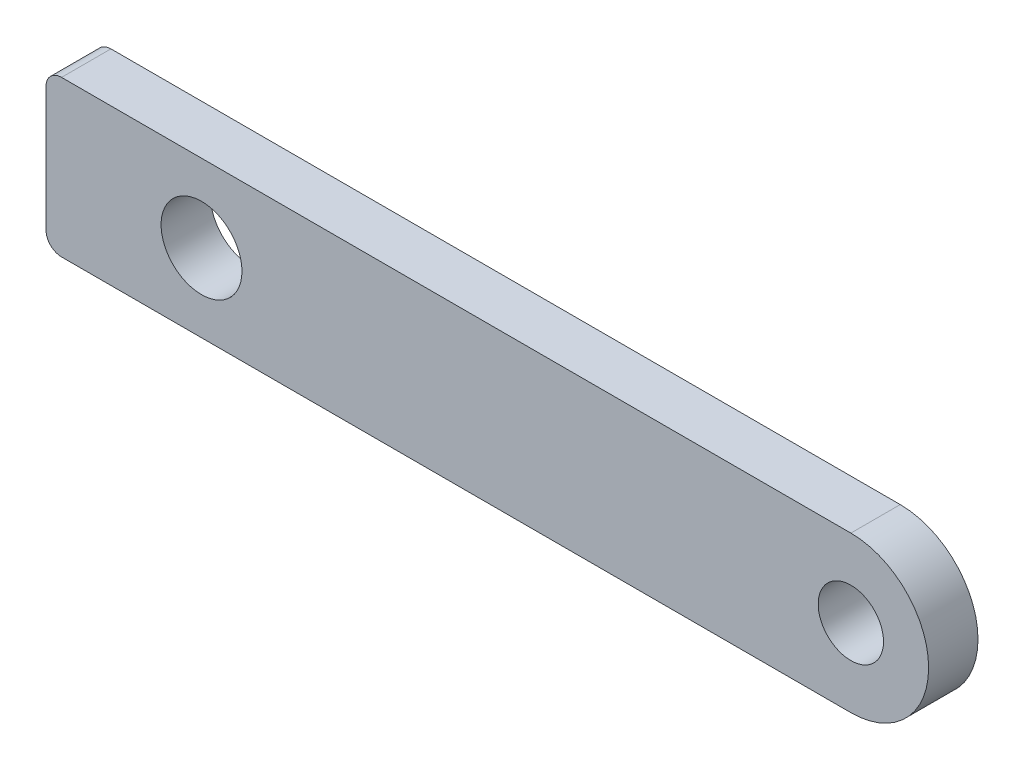
ISO-10303-21;
HEADER;
FILE_DESCRIPTION(('STEP AP214'),'2;1');
FILE_NAME('part.step','',(''),(''),'','','');
FILE_SCHEMA(('AUTOMOTIVE_DESIGN { 1 0 10303 214 1 1 1 1 }'));
ENDSEC;
DATA;
#1=APPLICATION_CONTEXT('core data for automotive mechanical design processes');
#2=APPLICATION_PROTOCOL_DEFINITION('international standard','automotive_design',2000,#1);
#3=PRODUCT_CONTEXT('',#1,'mechanical');
#4=PRODUCT('Part','Part','',(#3));
#5=PRODUCT_RELATED_PRODUCT_CATEGORY('part','',(#4));
#6=PRODUCT_DEFINITION_FORMATION('','',#4);
#7=PRODUCT_DEFINITION_CONTEXT('part definition',#1,'design');
#8=PRODUCT_DEFINITION('design','',#6,#7);
#9=PRODUCT_DEFINITION_SHAPE('','',#8);
#10=(LENGTH_UNIT() NAMED_UNIT(*) SI_UNIT(.MILLI.,.METRE.));
#11=(NAMED_UNIT(*) PLANE_ANGLE_UNIT() SI_UNIT($,.RADIAN.));
#12=(NAMED_UNIT(*) SI_UNIT($,.STERADIAN.) SOLID_ANGLE_UNIT());
#13=UNCERTAINTY_MEASURE_WITH_UNIT(LENGTH_MEASURE(1.E-05),#10,'distance_accuracy_value','');
#14=(GEOMETRIC_REPRESENTATION_CONTEXT(3) GLOBAL_UNCERTAINTY_ASSIGNED_CONTEXT((#13)) GLOBAL_UNIT_ASSIGNED_CONTEXT((#10,
#11,#12)) REPRESENTATION_CONTEXT('',''));
#15=CARTESIAN_POINT('',(0.,0.,0.));
#16=DIRECTION('',(0.,0.,1.));
#17=DIRECTION('',(1.,0.,0.));
#18=AXIS2_PLACEMENT_3D('',#15,#16,#17);
#19=CARTESIAN_POINT('',(1.,9.,0.));
#20=DIRECTION('',(0.,0.,1.));
#21=DIRECTION('',(1.,0.,0.));
#22=AXIS2_PLACEMENT_3D('',#19,#20,#21);
#23=CYLINDRICAL_SURFACE('',#22,0.999999999999998);
#24=CARTESIAN_POINT('',(1.,9.,3.175));
#25=DIRECTION('',(0.,0.,1.));
#26=DIRECTION('',(1.,0.,0.));
#27=AXIS2_PLACEMENT_3D('',#24,#25,#26);
#28=CIRCLE('',#27,0.999999999999998);
#29=CARTESIAN_POINT('',(1.,10.,3.175));
#30=VERTEX_POINT('',#29);
#31=CARTESIAN_POINT('',(0.,9.,3.175));
#32=VERTEX_POINT('',#31);
#33=EDGE_CURVE('E117',#30,#32,#28,.T.);
#34=ORIENTED_EDGE('',*,*,#33,.F.);
#35=DIRECTION('',(0.,0.,1.));
#36=VECTOR('',#35,1.);
#37=CARTESIAN_POINT('',(1.,10.,0.));
#38=LINE('',#37,#36);
#39=CARTESIAN_POINT('',(1.,10.,0.));
#40=VERTEX_POINT('',#39);
#41=EDGE_CURVE('E11',#40,#30,#38,.T.);
#42=ORIENTED_EDGE('',*,*,#41,.F.);
#43=CARTESIAN_POINT('',(1.,9.,0.));
#44=DIRECTION('',(0.,0.,1.));
#45=DIRECTION('',(1.,0.,0.));
#46=AXIS2_PLACEMENT_3D('',#43,#44,#45);
#47=CIRCLE('',#46,0.999999999999998);
#48=CARTESIAN_POINT('',(0.,9.,0.));
#49=VERTEX_POINT('',#48);
#50=EDGE_CURVE('E132',#40,#49,#47,.T.);
#51=ORIENTED_EDGE('',*,*,#50,.T.);
#52=DIRECTION('',(0.,0.,1.));
#53=VECTOR('',#52,1.);
#54=CARTESIAN_POINT('',(0.,9.,0.));
#55=LINE('',#54,#53);
#56=EDGE_CURVE('E35',#49,#32,#55,.T.);
#57=ORIENTED_EDGE('',*,*,#56,.T.);
#58=EDGE_LOOP('',(#34,#42,#51,#57));
#59=FACE_BOUND('',#58,.T.);
#60=ADVANCED_FACE('F32',(#59),#23,.T.);
#61=CARTESIAN_POINT('',(51.75,10.,0.));
#62=DIRECTION('',(0.,1.,0.));
#63=DIRECTION('',(-1.,0.,0.));
#64=AXIS2_PLACEMENT_3D('',#61,#62,#63);
#65=PLANE('',#64);
#66=DIRECTION('',(-1.,0.,0.));
#67=VECTOR('',#66,1.);
#68=CARTESIAN_POINT('',(51.75,10.,3.175));
#69=LINE('',#68,#67);
#70=CARTESIAN_POINT('',(51.75,10.,3.175));
#71=VERTEX_POINT('',#70);
#72=EDGE_CURVE('E130',#71,#30,#69,.T.);
#73=ORIENTED_EDGE('',*,*,#72,.F.);
#74=DIRECTION('',(0.,0.,1.));
#75=VECTOR('',#74,1.);
#76=CARTESIAN_POINT('',(51.75,10.,0.));
#77=LINE('',#76,#75);
#78=CARTESIAN_POINT('',(51.75,10.,0.));
#79=VERTEX_POINT('',#78);
#80=EDGE_CURVE('E41',#79,#71,#77,.T.);
#81=ORIENTED_EDGE('',*,*,#80,.F.);
#82=DIRECTION('',(-1.,0.,0.));
#83=VECTOR('',#82,1.);
#84=CARTESIAN_POINT('',(51.75,10.,0.));
#85=LINE('',#84,#83);
#86=EDGE_CURVE('E107',#79,#40,#85,.T.);
#87=ORIENTED_EDGE('',*,*,#86,.T.);
#88=ORIENTED_EDGE('',*,*,#41,.T.);
#89=EDGE_LOOP('',(#73,#81,#87,#88));
#90=FACE_BOUND('',#89,.T.);
#91=ADVANCED_FACE('F140',(#90),#65,.T.);
#92=CARTESIAN_POINT('',(51.75,5.,0.));
#93=DIRECTION('',(0.,0.,1.));
#94=DIRECTION('',(1.,0.,0.));
#95=AXIS2_PLACEMENT_3D('',#92,#93,#94);
#96=CYLINDRICAL_SURFACE('',#95,5.);
#97=CARTESIAN_POINT('',(51.75,5.,3.175));
#98=DIRECTION('',(0.,0.,1.));
#99=DIRECTION('',(1.,0.,0.));
#100=AXIS2_PLACEMENT_3D('',#97,#98,#99);
#101=CIRCLE('',#100,5.);
#102=CARTESIAN_POINT('',(51.75,0.,3.175));
#103=VERTEX_POINT('',#102);
#104=EDGE_CURVE('E94',#103,#71,#101,.T.);
#105=ORIENTED_EDGE('',*,*,#104,.F.);
#106=DIRECTION('',(0.,0.,1.));
#107=VECTOR('',#106,1.);
#108=CARTESIAN_POINT('',(51.75,0.,0.));
#109=LINE('',#108,#107);
#110=CARTESIAN_POINT('',(51.75,0.,0.));
#111=VERTEX_POINT('',#110);
#112=EDGE_CURVE('E89',#111,#103,#109,.T.);
#113=ORIENTED_EDGE('',*,*,#112,.F.);
#114=CARTESIAN_POINT('',(51.75,5.,0.));
#115=DIRECTION('',(0.,0.,1.));
#116=DIRECTION('',(1.,0.,0.));
#117=AXIS2_PLACEMENT_3D('',#114,#115,#116);
#118=CIRCLE('',#117,5.);
#119=EDGE_CURVE('E92',#111,#79,#118,.T.);
#120=ORIENTED_EDGE('',*,*,#119,.T.);
#121=ORIENTED_EDGE('',*,*,#80,.T.);
#122=EDGE_LOOP('',(#105,#113,#120,#121));
#123=FACE_BOUND('',#122,.T.);
#124=ADVANCED_FACE('F91',(#123),#96,.T.);
#125=CARTESIAN_POINT('',(0.999999999999999,0.,0.));
#126=DIRECTION('',(0.,-1.,0.));
#127=DIRECTION('',(0.,0.,-1.));
#128=AXIS2_PLACEMENT_3D('',#125,#126,#127);
#129=PLANE('',#128);
#130=DIRECTION('',(1.,0.,0.));
#131=VECTOR('',#130,1.);
#132=CARTESIAN_POINT('',(0.999999999999999,0.,3.175));
#133=LINE('',#132,#131);
#134=CARTESIAN_POINT('',(0.999999999999999,0.,3.175));
#135=VERTEX_POINT('',#134);
#136=EDGE_CURVE('E127',#135,#103,#133,.T.);
#137=ORIENTED_EDGE('',*,*,#136,.F.);
#138=DIRECTION('',(0.,0.,1.));
#139=VECTOR('',#138,1.);
#140=CARTESIAN_POINT('',(0.999999999999999,0.,0.));
#141=LINE('',#140,#139);
#142=CARTESIAN_POINT('',(0.999999999999999,0.,0.));
#143=VERTEX_POINT('',#142);
#144=EDGE_CURVE('E99',#143,#135,#141,.T.);
#145=ORIENTED_EDGE('',*,*,#144,.F.);
#146=DIRECTION('',(1.,0.,0.));
#147=VECTOR('',#146,1.);
#148=CARTESIAN_POINT('',(0.999999999999999,0.,0.));
#149=LINE('',#148,#147);
#150=EDGE_CURVE('E105',#143,#111,#149,.T.);
#151=ORIENTED_EDGE('',*,*,#150,.T.);
#152=ORIENTED_EDGE('',*,*,#112,.T.);
#153=EDGE_LOOP('',(#137,#145,#151,#152));
#154=FACE_BOUND('',#153,.T.);
#155=ADVANCED_FACE('F109',(#154),#129,.T.);
#156=CARTESIAN_POINT('',(1.,1.,0.));
#157=DIRECTION('',(0.,0.,1.));
#158=DIRECTION('',(1.,0.,0.));
#159=AXIS2_PLACEMENT_3D('',#156,#157,#158);
#160=CYLINDRICAL_SURFACE('',#159,1.);
#161=CARTESIAN_POINT('',(1.,1.,3.175));
#162=DIRECTION('',(0.,0.,1.));
#163=DIRECTION('',(1.,0.,0.));
#164=AXIS2_PLACEMENT_3D('',#161,#162,#163);
#165=CIRCLE('',#164,1.);
#166=CARTESIAN_POINT('',(0.,1.,3.175));
#167=VERTEX_POINT('',#166);
#168=EDGE_CURVE('E124',#167,#135,#165,.T.);
#169=ORIENTED_EDGE('',*,*,#168,.F.);
#170=DIRECTION('',(0.,0.,1.));
#171=VECTOR('',#170,1.);
#172=CARTESIAN_POINT('',(0.,1.,0.));
#173=LINE('',#172,#171);
#174=CARTESIAN_POINT('',(0.,1.,0.));
#175=VERTEX_POINT('',#174);
#176=EDGE_CURVE('E135',#175,#167,#173,.T.);
#177=ORIENTED_EDGE('',*,*,#176,.F.);
#178=CARTESIAN_POINT('',(1.,1.,0.));
#179=DIRECTION('',(0.,0.,1.));
#180=DIRECTION('',(1.,0.,0.));
#181=AXIS2_PLACEMENT_3D('',#178,#179,#180);
#182=CIRCLE('',#181,1.);
#183=EDGE_CURVE('E110',#175,#143,#182,.T.);
#184=ORIENTED_EDGE('',*,*,#183,.T.);
#185=ORIENTED_EDGE('',*,*,#144,.T.);
#186=EDGE_LOOP('',(#169,#177,#184,#185));
#187=FACE_BOUND('',#186,.T.);
#188=ADVANCED_FACE('F153',(#187),#160,.T.);
#189=CARTESIAN_POINT('',(0.,9.,0.));
#190=DIRECTION('',(-1.,0.,0.));
#191=DIRECTION('',(0.,-1.,0.));
#192=AXIS2_PLACEMENT_3D('',#189,#190,#191);
#193=PLANE('',#192);
#194=DIRECTION('',(0.,-1.,0.));
#195=VECTOR('',#194,1.);
#196=CARTESIAN_POINT('',(0.,9.,3.175));
#197=LINE('',#196,#195);
#198=EDGE_CURVE('E120',#32,#167,#197,.T.);
#199=ORIENTED_EDGE('',*,*,#198,.F.);
#200=ORIENTED_EDGE('',*,*,#56,.F.);
#201=DIRECTION('',(0.,-1.,0.));
#202=VECTOR('',#201,1.);
#203=CARTESIAN_POINT('',(0.,9.,0.));
#204=LINE('',#203,#202);
#205=EDGE_CURVE('E112',#49,#175,#204,.T.);
#206=ORIENTED_EDGE('',*,*,#205,.T.);
#207=ORIENTED_EDGE('',*,*,#176,.T.);
#208=EDGE_LOOP('',(#199,#200,#206,#207));
#209=FACE_BOUND('',#208,.T.);
#210=ADVANCED_FACE('F137',(#209),#193,.T.);
#211=CARTESIAN_POINT('',(1.,9.,0.));
#212=DIRECTION('',(0.,0.,1.));
#213=DIRECTION('',(1.,0.,0.));
#214=AXIS2_PLACEMENT_3D('',#211,#212,#213);
#215=PLANE('',#214);
#216=CARTESIAN_POINT('',(10.,5.,0.));
#217=DIRECTION('',(0.,0.,1.));
#218=DIRECTION('',(1.,0.,0.));
#219=AXIS2_PLACEMENT_3D('',#216,#217,#218);
#220=CIRCLE('',#219,2.59999999999999);
#221=CARTESIAN_POINT('',(12.6,5.,0.));
#222=VERTEX_POINT('',#221);
#223=EDGE_CURVE('E179',#222,#222,#220,.T.);
#224=ORIENTED_EDGE('',*,*,#223,.T.);
#225=EDGE_LOOP('',(#224));
#226=FACE_BOUND('',#225,.T.);
#227=CARTESIAN_POINT('',(51.75,5.,0.));
#228=DIRECTION('',(0.,0.,1.));
#229=DIRECTION('',(1.,0.,0.));
#230=AXIS2_PLACEMENT_3D('',#227,#228,#229);
#231=CIRCLE('',#230,2.09999999999998);
#232=CARTESIAN_POINT('',(53.85,5.,0.));
#233=VERTEX_POINT('',#232);
#234=EDGE_CURVE('E121',#233,#233,#231,.T.);
#235=ORIENTED_EDGE('',*,*,#234,.T.);
#236=EDGE_LOOP('',(#235));
#237=FACE_BOUND('',#236,.T.);
#238=ORIENTED_EDGE('',*,*,#50,.F.);
#239=ORIENTED_EDGE('',*,*,#86,.F.);
#240=ORIENTED_EDGE('',*,*,#119,.F.);
#241=ORIENTED_EDGE('',*,*,#150,.F.);
#242=ORIENTED_EDGE('',*,*,#183,.F.);
#243=ORIENTED_EDGE('',*,*,#205,.F.);
#244=EDGE_LOOP('',(#238,#239,#240,#241,#242,#243));
#245=FACE_BOUND('',#244,.T.);
#246=ADVANCED_FACE('F103',(#226,#237,#245),#215,.F.);
#247=CARTESIAN_POINT('',(1.,9.,3.175));
#248=DIRECTION('',(0.,0.,1.));
#249=DIRECTION('',(1.,0.,0.));
#250=AXIS2_PLACEMENT_3D('',#247,#248,#249);
#251=PLANE('',#250);
#252=CARTESIAN_POINT('',(10.,5.,3.175));
#253=DIRECTION('',(0.,0.,1.));
#254=DIRECTION('',(1.,0.,0.));
#255=AXIS2_PLACEMENT_3D('',#252,#253,#254);
#256=CIRCLE('',#255,2.59999999999999);
#257=CARTESIAN_POINT('',(12.6,5.,3.175));
#258=VERTEX_POINT('',#257);
#259=EDGE_CURVE('E182',#258,#258,#256,.T.);
#260=ORIENTED_EDGE('',*,*,#259,.F.);
#261=EDGE_LOOP('',(#260));
#262=FACE_BOUND('',#261,.T.);
#263=CARTESIAN_POINT('',(51.75,5.,3.175));
#264=DIRECTION('',(0.,0.,1.));
#265=DIRECTION('',(1.,0.,0.));
#266=AXIS2_PLACEMENT_3D('',#263,#264,#265);
#267=CIRCLE('',#266,2.09999999999998);
#268=CARTESIAN_POINT('',(53.85,5.,3.175));
#269=VERTEX_POINT('',#268);
#270=EDGE_CURVE('E184',#269,#269,#267,.T.);
#271=ORIENTED_EDGE('',*,*,#270,.F.);
#272=EDGE_LOOP('',(#271));
#273=FACE_BOUND('',#272,.T.);
#274=ORIENTED_EDGE('',*,*,#33,.T.);
#275=ORIENTED_EDGE('',*,*,#198,.T.);
#276=ORIENTED_EDGE('',*,*,#168,.T.);
#277=ORIENTED_EDGE('',*,*,#136,.T.);
#278=ORIENTED_EDGE('',*,*,#104,.T.);
#279=ORIENTED_EDGE('',*,*,#72,.T.);
#280=EDGE_LOOP('',(#274,#275,#276,#277,#278,#279));
#281=FACE_BOUND('',#280,.T.);
#282=ADVANCED_FACE('F139',(#262,#273,#281),#251,.T.);
#283=CARTESIAN_POINT('',(51.75,5.,3.175));
#284=DIRECTION('',(0.,0.,1.));
#285=DIRECTION('',(1.,0.,0.));
#286=AXIS2_PLACEMENT_3D('',#283,#284,#285);
#287=CYLINDRICAL_SURFACE('',#286,2.09999999999998);
#288=ORIENTED_EDGE('',*,*,#234,.F.);
#289=EDGE_LOOP('',(#288));
#290=FACE_BOUND('',#289,.T.);
#291=ORIENTED_EDGE('',*,*,#270,.T.);
#292=EDGE_LOOP('',(#291));
#293=FACE_BOUND('',#292,.T.);
#294=ADVANCED_FACE('F164',(#290,#293),#287,.F.);
#295=CARTESIAN_POINT('',(10.,5.,3.175));
#296=DIRECTION('',(0.,0.,1.));
#297=DIRECTION('',(1.,0.,0.));
#298=AXIS2_PLACEMENT_3D('',#295,#296,#297);
#299=CYLINDRICAL_SURFACE('',#298,2.59999999999999);
#300=ORIENTED_EDGE('',*,*,#223,.F.);
#301=EDGE_LOOP('',(#300));
#302=FACE_BOUND('',#301,.T.);
#303=ORIENTED_EDGE('',*,*,#259,.T.);
#304=EDGE_LOOP('',(#303));
#305=FACE_BOUND('',#304,.T.);
#306=ADVANCED_FACE('F171',(#302,#305),#299,.F.);
#307=CLOSED_SHELL('',(#60,#91,#124,#155,#188,#210,#246,#282,#294,#306));
#308=MANIFOLD_SOLID_BREP('B2',#307);
#309=ADVANCED_BREP_SHAPE_REPRESENTATION('',(#18,#308),#14);
#310=SHAPE_DEFINITION_REPRESENTATION(#9,#309);
ENDSEC;
END-ISO-10303-21;
